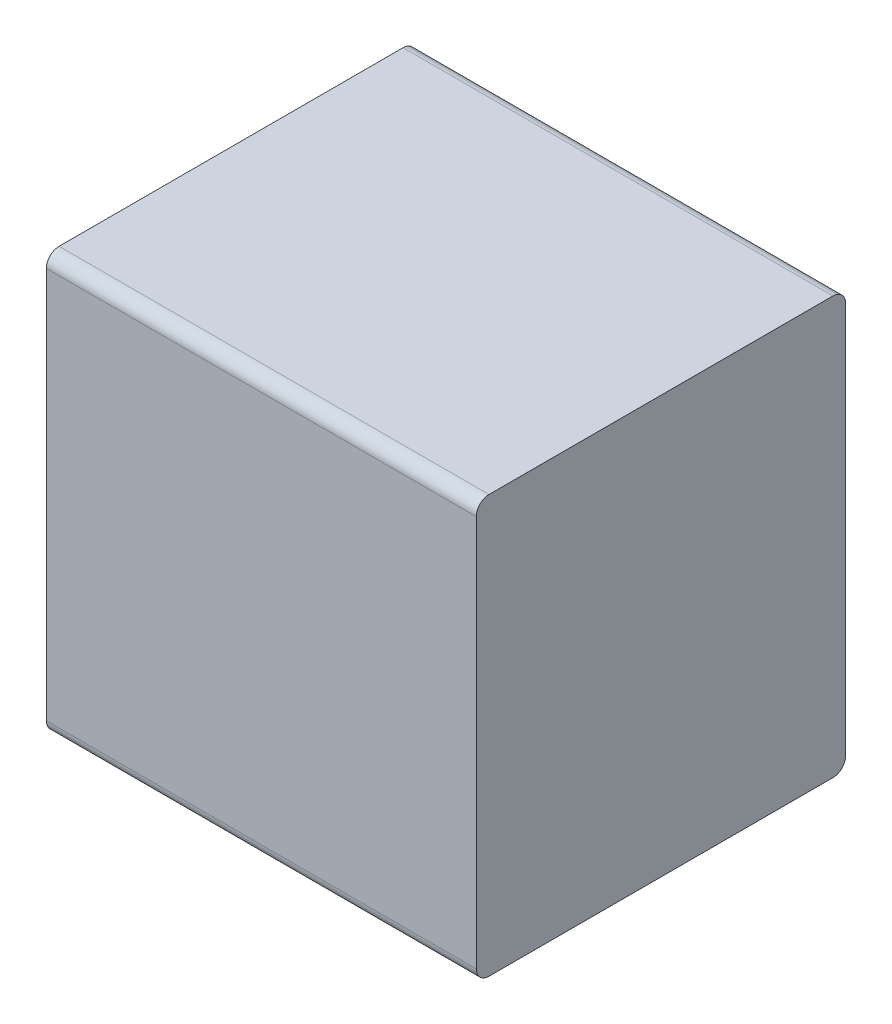
ISO-10303-21;
HEADER;
FILE_DESCRIPTION(('STEP AP214'),'2;1');
FILE_NAME('part.step','',(''),(''),'','','');
FILE_SCHEMA(('AUTOMOTIVE_DESIGN { 1 0 10303 214 1 1 1 1 }'));
ENDSEC;
DATA;
#1=APPLICATION_CONTEXT('core data for automotive mechanical design processes');
#2=APPLICATION_PROTOCOL_DEFINITION('international standard','automotive_design',2000,#1);
#3=PRODUCT_CONTEXT('',#1,'mechanical');
#4=PRODUCT('Part','Part','',(#3));
#5=PRODUCT_RELATED_PRODUCT_CATEGORY('part','',(#4));
#6=PRODUCT_DEFINITION_FORMATION('','',#4);
#7=PRODUCT_DEFINITION_CONTEXT('part definition',#1,'design');
#8=PRODUCT_DEFINITION('design','',#6,#7);
#9=PRODUCT_DEFINITION_SHAPE('','',#8);
#10=(LENGTH_UNIT() NAMED_UNIT(*) SI_UNIT(.MILLI.,.METRE.));
#11=(NAMED_UNIT(*) PLANE_ANGLE_UNIT() SI_UNIT($,.RADIAN.));
#12=(NAMED_UNIT(*) SI_UNIT($,.STERADIAN.) SOLID_ANGLE_UNIT());
#13=UNCERTAINTY_MEASURE_WITH_UNIT(LENGTH_MEASURE(1.E-05),#10,'distance_accuracy_value','');
#14=(GEOMETRIC_REPRESENTATION_CONTEXT(3) GLOBAL_UNCERTAINTY_ASSIGNED_CONTEXT((#13)) GLOBAL_UNIT_ASSIGNED_CONTEXT((#10,
#11,#12)) REPRESENTATION_CONTEXT('',''));
#15=CARTESIAN_POINT('',(0.,0.,0.));
#16=DIRECTION('',(0.,0.,1.));
#17=DIRECTION('',(1.,0.,0.));
#18=AXIS2_PLACEMENT_3D('',#15,#16,#17);
#19=CARTESIAN_POINT('',(500000.,0.886666666667,-0.360000000043));
#20=DIRECTION('',(0.,-1.,0.));
#21=DIRECTION('',(0.,0.,-1.));
#22=AXIS2_PLACEMENT_3D('',#19,#20,#21);
#23=PLANE('',#22);
#24=DIRECTION('',(-1.,0.,0.));
#25=VECTOR('',#24,1.);
#26=CARTESIAN_POINT('',(500000.,0.88666666666667,-0.360000000043368));
#27=LINE('',#26,#25);
#28=CARTESIAN_POINT('',(-0.450000000000546,0.886666666666918,-0.359999999999816));
#29=VERTEX_POINT('',#28);
#30=CARTESIAN_POINT('',(0.450000000000546,0.886666666666918,-0.359999999999816));
#31=VERTEX_POINT('',#30);
#32=EDGE_CURVE('E105',#29,#31,#27,.F.);
#33=ORIENTED_EDGE('',*,*,#32,.F.);
#34=DIRECTION('',(0.,0.,-1.));
#35=VECTOR('',#34,1.);
#36=CARTESIAN_POINT('',(-0.45,0.886666666667,-0.36));
#37=LINE('',#36,#35);
#38=CARTESIAN_POINT('',(-0.450000000000546,0.886666666666918,0.360000000000184));
#39=VERTEX_POINT('',#38);
#40=EDGE_CURVE('E104',#29,#39,#37,.F.);
#41=ORIENTED_EDGE('',*,*,#40,.T.);
#42=DIRECTION('',(-1.,0.,0.));
#43=VECTOR('',#42,1.);
#44=CARTESIAN_POINT('',(500000.,0.88666666666667,0.359999999956632));
#45=LINE('',#44,#43);
#46=CARTESIAN_POINT('',(0.450000000000546,0.886666666666918,0.360000000000184));
#47=VERTEX_POINT('',#46);
#48=EDGE_CURVE('E79',#47,#39,#45,.T.);
#49=ORIENTED_EDGE('',*,*,#48,.F.);
#50=DIRECTION('',(0.,0.,-1.));
#51=VECTOR('',#50,1.);
#52=CARTESIAN_POINT('',(0.45,0.886666666667,-0.4));
#53=LINE('',#52,#51);
#54=EDGE_CURVE('E128',#31,#47,#53,.F.);
#55=ORIENTED_EDGE('',*,*,#54,.F.);
#56=EDGE_LOOP('',(#33,#41,#49,#55));
#57=FACE_BOUND('',#56,.T.);
#58=ADVANCED_FACE('F17',(#57),#23,.F.);
#59=CARTESIAN_POINT('',(500000.,0.86,0.359999999957));
#60=DIRECTION('',(-1.,0.,0.));
#61=DIRECTION('',(0.,0.,1.));
#62=AXIS2_PLACEMENT_3D('',#59,#60,#61);
#63=CYLINDRICAL_SURFACE('',#62,0.02666666666667);
#64=CARTESIAN_POINT('',(-0.450000000000728,0.86,0.360000000000368));
#65=DIRECTION('',(-1.,0.,0.));
#66=DIRECTION('',(0.,0.,1.));
#67=AXIS2_PLACEMENT_3D('',#64,#65,#66);
#68=CIRCLE('',#67,0.02666666666667);
#69=CARTESIAN_POINT('',(-0.450000000000728,0.86,0.386666666666684));
#70=VERTEX_POINT('',#69);
#71=EDGE_CURVE('E20',#39,#70,#68,.F.);
#72=ORIENTED_EDGE('',*,*,#71,.T.);
#73=DIRECTION('',(-1.,0.,0.));
#74=VECTOR('',#73,1.);
#75=CARTESIAN_POINT('',(500000.,0.86,0.386666666623));
#76=LINE('',#75,#74);
#77=CARTESIAN_POINT('',(0.450000000000728,0.86,0.386666666666684));
#78=VERTEX_POINT('',#77);
#79=EDGE_CURVE('E86',#70,#78,#76,.F.);
#80=ORIENTED_EDGE('',*,*,#79,.T.);
#81=CARTESIAN_POINT('',(0.450000000000728,0.86,0.360000000000368));
#82=DIRECTION('',(-1.,0.,0.));
#83=DIRECTION('',(0.,0.,1.));
#84=AXIS2_PLACEMENT_3D('',#81,#82,#83);
#85=CIRCLE('',#84,0.02666666666667);
#86=EDGE_CURVE('E126',#47,#78,#85,.F.);
#87=ORIENTED_EDGE('',*,*,#86,.F.);
#88=ORIENTED_EDGE('',*,*,#48,.T.);
#89=EDGE_LOOP('',(#72,#80,#87,#88));
#90=FACE_BOUND('',#89,.T.);
#91=ADVANCED_FACE('F103',(#90),#63,.T.);
#92=CARTESIAN_POINT('',(500000.,0.86,0.386666666623));
#93=DIRECTION('',(0.,0.,-1.));
#94=DIRECTION('',(-1.,0.,0.));
#95=AXIS2_PLACEMENT_3D('',#92,#93,#94);
#96=PLANE('',#95);
#97=ORIENTED_EDGE('',*,*,#79,.F.);
#98=DIRECTION('',(0.,1.,0.));
#99=VECTOR('',#98,1.);
#100=CARTESIAN_POINT('',(-0.45,0.86,0.386666666667));
#101=LINE('',#100,#99);
#102=CARTESIAN_POINT('',(-0.450000000000546,0.04,0.38666666666701));
#103=VERTEX_POINT('',#102);
#104=EDGE_CURVE('E90',#70,#103,#101,.F.);
#105=ORIENTED_EDGE('',*,*,#104,.T.);
#106=DIRECTION('',(-1.,0.,0.));
#107=VECTOR('',#106,1.);
#108=CARTESIAN_POINT('',(500000.,0.04,0.38666666662367));
#109=LINE('',#108,#107);
#110=CARTESIAN_POINT('',(0.450000000000546,0.04,0.386666666667009));
#111=VERTEX_POINT('',#110);
#112=EDGE_CURVE('E92',#111,#103,#109,.T.);
#113=ORIENTED_EDGE('',*,*,#112,.F.);
#114=DIRECTION('',(0.,1.,0.));
#115=VECTOR('',#114,1.);
#116=CARTESIAN_POINT('',(0.45,0.9,0.386666666667));
#117=LINE('',#116,#115);
#118=EDGE_CURVE('E91',#78,#111,#117,.F.);
#119=ORIENTED_EDGE('',*,*,#118,.F.);
#120=EDGE_LOOP('',(#97,#105,#113,#119));
#121=FACE_BOUND('',#120,.T.);
#122=ADVANCED_FACE('F88',(#121),#96,.F.);
#123=CARTESIAN_POINT('',(500000.,0.04,0.359999999957));
#124=DIRECTION('',(-1.,0.,0.));
#125=DIRECTION('',(0.,0.,1.));
#126=AXIS2_PLACEMENT_3D('',#123,#124,#125);
#127=CYLINDRICAL_SURFACE('',#126,0.02666666666667);
#128=CARTESIAN_POINT('',(-0.450000000000728,0.04,0.360000000000368));
#129=DIRECTION('',(-1.,0.,0.));
#130=DIRECTION('',(0.,0.,1.));
#131=AXIS2_PLACEMENT_3D('',#128,#129,#130);
#132=CIRCLE('',#131,0.02666666666667);
#133=CARTESIAN_POINT('',(-0.450000000000546,0.01333333333333,0.360000000000184));
#134=VERTEX_POINT('',#133);
#135=EDGE_CURVE('E101',#103,#134,#132,.F.);
#136=ORIENTED_EDGE('',*,*,#135,.T.);
#137=DIRECTION('',(1.,0.,0.));
#138=VECTOR('',#137,1.);
#139=CARTESIAN_POINT('',(500000.,0.01333333333333,0.36));
#140=LINE('',#139,#138);
#141=CARTESIAN_POINT('',(0.450000000000546,0.01333333333333,0.360000000000184));
#142=VERTEX_POINT('',#141);
#143=EDGE_CURVE('E109',#134,#142,#140,.T.);
#144=ORIENTED_EDGE('',*,*,#143,.T.);
#145=CARTESIAN_POINT('',(0.450000000000728,0.04,0.360000000000368));
#146=DIRECTION('',(-1.,0.,0.));
#147=DIRECTION('',(0.,0.,1.));
#148=AXIS2_PLACEMENT_3D('',#145,#146,#147);
#149=CIRCLE('',#148,0.02666666666667);
#150=EDGE_CURVE('E124',#111,#142,#149,.F.);
#151=ORIENTED_EDGE('',*,*,#150,.F.);
#152=ORIENTED_EDGE('',*,*,#112,.T.);
#153=EDGE_LOOP('',(#136,#144,#151,#152));
#154=FACE_BOUND('',#153,.T.);
#155=ADVANCED_FACE('F163',(#154),#127,.T.);
#156=CARTESIAN_POINT('',(500000.,0.01333333333333,0.359999999957));
#157=DIRECTION('',(0.,1.,0.));
#158=DIRECTION('',(0.,0.,1.));
#159=AXIS2_PLACEMENT_3D('',#156,#157,#158);
#160=PLANE('',#159);
#161=ORIENTED_EDGE('',*,*,#143,.F.);
#162=DIRECTION('',(0.,0.,-1.));
#163=VECTOR('',#162,1.);
#164=CARTESIAN_POINT('',(-0.45,0.01333333333333,-0.36));
#165=LINE('',#164,#163);
#166=CARTESIAN_POINT('',(-0.450000000000546,0.01333333333333,-0.359999999999816));
#167=VERTEX_POINT('',#166);
#168=EDGE_CURVE('E134',#134,#167,#165,.T.);
#169=ORIENTED_EDGE('',*,*,#168,.T.);
#170=DIRECTION('',(-1.,0.,0.));
#171=VECTOR('',#170,1.);
#172=CARTESIAN_POINT('',(500000.,0.01333333333333,-0.360000000043368));
#173=LINE('',#172,#171);
#174=CARTESIAN_POINT('',(0.450000000000546,0.01333333333333,-0.359999999999816));
#175=VERTEX_POINT('',#174);
#176=EDGE_CURVE('E113',#175,#167,#173,.T.);
#177=ORIENTED_EDGE('',*,*,#176,.F.);
#178=DIRECTION('',(0.,0.,-1.));
#179=VECTOR('',#178,1.);
#180=CARTESIAN_POINT('',(0.45,0.01333333333333,-0.4));
#181=LINE('',#180,#179);
#182=EDGE_CURVE('E123',#142,#175,#181,.T.);
#183=ORIENTED_EDGE('',*,*,#182,.F.);
#184=EDGE_LOOP('',(#161,#169,#177,#183));
#185=FACE_BOUND('',#184,.T.);
#186=ADVANCED_FACE('F152',(#185),#160,.F.);
#187=CARTESIAN_POINT('',(500000.,0.86,-0.360000000043));
#188=DIRECTION('',(-1.,0.,0.));
#189=DIRECTION('',(0.,0.,1.));
#190=AXIS2_PLACEMENT_3D('',#187,#188,#189);
#191=CYLINDRICAL_SURFACE('',#190,0.02666666666667);
#192=CARTESIAN_POINT('',(-0.450000000000728,0.86,-0.359999999999632));
#193=DIRECTION('',(-1.,0.,0.));
#194=DIRECTION('',(0.,0.,1.));
#195=AXIS2_PLACEMENT_3D('',#192,#193,#194);
#196=CIRCLE('',#195,0.02666666666667);
#197=CARTESIAN_POINT('',(-0.450000000000728,0.86,-0.386666666666632));
#198=VERTEX_POINT('',#197);
#199=EDGE_CURVE('E116',#198,#29,#196,.F.);
#200=ORIENTED_EDGE('',*,*,#199,.T.);
#201=ORIENTED_EDGE('',*,*,#32,.T.);
#202=CARTESIAN_POINT('',(0.450000000000728,0.86,-0.359999999999632));
#203=DIRECTION('',(-1.,0.,0.));
#204=DIRECTION('',(0.,0.,1.));
#205=AXIS2_PLACEMENT_3D('',#202,#203,#204);
#206=CIRCLE('',#205,0.02666666666667);
#207=CARTESIAN_POINT('',(0.450000000000728,0.86,-0.386666666666632));
#208=VERTEX_POINT('',#207);
#209=EDGE_CURVE('E129',#208,#31,#206,.F.);
#210=ORIENTED_EDGE('',*,*,#209,.F.);
#211=DIRECTION('',(1.,0.,0.));
#212=VECTOR('',#211,1.);
#213=CARTESIAN_POINT('',(500000.,0.86,-0.38666666671));
#214=LINE('',#213,#212);
#215=EDGE_CURVE('E122',#208,#198,#214,.F.);
#216=ORIENTED_EDGE('',*,*,#215,.T.);
#217=EDGE_LOOP('',(#200,#201,#210,#216));
#218=FACE_BOUND('',#217,.T.);
#219=ADVANCED_FACE('F160',(#218),#191,.T.);
#220=CARTESIAN_POINT('',(-0.45,0.86,-0.36));
#221=DIRECTION('',(1.,0.,0.));
#222=DIRECTION('',(0.,0.,-1.));
#223=AXIS2_PLACEMENT_3D('',#220,#221,#222);
#224=PLANE('',#223);
#225=DIRECTION('',(0.,1.,0.));
#226=VECTOR('',#225,1.);
#227=CARTESIAN_POINT('',(-0.450000000000728,0.04,-0.386666666666632));
#228=LINE('',#227,#226);
#229=CARTESIAN_POINT('',(-0.450000000000728,0.04,-0.386666666666632));
#230=VERTEX_POINT('',#229);
#231=EDGE_CURVE('E141',#198,#230,#228,.F.);
#232=ORIENTED_EDGE('',*,*,#231,.T.);
#233=CARTESIAN_POINT('',(-0.450000000000728,0.04,-0.359999999999632));
#234=DIRECTION('',(-1.,0.,0.));
#235=DIRECTION('',(0.,0.,1.));
#236=AXIS2_PLACEMENT_3D('',#233,#234,#235);
#237=CIRCLE('',#236,0.02666666666667);
#238=EDGE_CURVE('E115',#167,#230,#237,.F.);
#239=ORIENTED_EDGE('',*,*,#238,.F.);
#240=ORIENTED_EDGE('',*,*,#168,.F.);
#241=ORIENTED_EDGE('',*,*,#135,.F.);
#242=ORIENTED_EDGE('',*,*,#104,.F.);
#243=ORIENTED_EDGE('',*,*,#71,.F.);
#244=ORIENTED_EDGE('',*,*,#40,.F.);
#245=ORIENTED_EDGE('',*,*,#199,.F.);
#246=EDGE_LOOP('',(#232,#239,#240,#241,#242,#243,#244,#245));
#247=FACE_BOUND('',#246,.T.);
#248=ADVANCED_FACE('F97',(#247),#224,.F.);
#249=CARTESIAN_POINT('',(500000.,0.04,-0.360000000043));
#250=DIRECTION('',(-1.,0.,0.));
#251=DIRECTION('',(0.,0.,1.));
#252=AXIS2_PLACEMENT_3D('',#249,#250,#251);
#253=CYLINDRICAL_SURFACE('',#252,0.02666666666667);
#254=ORIENTED_EDGE('',*,*,#238,.T.);
#255=DIRECTION('',(1.,0.,0.));
#256=VECTOR('',#255,1.);
#257=CARTESIAN_POINT('',(500000.,0.04,-0.38666666671));
#258=LINE('',#257,#256);
#259=CARTESIAN_POINT('',(0.450000000000728,0.04,-0.386666666666632));
#260=VERTEX_POINT('',#259);
#261=EDGE_CURVE('E26',#230,#260,#258,.T.);
#262=ORIENTED_EDGE('',*,*,#261,.T.);
#263=CARTESIAN_POINT('',(0.450000000000728,0.04,-0.359999999999632));
#264=DIRECTION('',(-1.,0.,0.));
#265=DIRECTION('',(0.,0.,1.));
#266=AXIS2_PLACEMENT_3D('',#263,#264,#265);
#267=CIRCLE('',#266,0.02666666666667);
#268=EDGE_CURVE('E34',#175,#260,#267,.F.);
#269=ORIENTED_EDGE('',*,*,#268,.F.);
#270=ORIENTED_EDGE('',*,*,#176,.T.);
#271=EDGE_LOOP('',(#254,#262,#269,#270));
#272=FACE_BOUND('',#271,.T.);
#273=ADVANCED_FACE('F154',(#272),#253,.T.);
#274=CARTESIAN_POINT('',(0.45,0.9,-0.4));
#275=DIRECTION('',(1.,0.,0.));
#276=DIRECTION('',(0.,0.,-1.));
#277=AXIS2_PLACEMENT_3D('',#274,#275,#276);
#278=PLANE('',#277);
#279=ORIENTED_EDGE('',*,*,#268,.T.);
#280=DIRECTION('',(0.,1.,0.));
#281=VECTOR('',#280,1.);
#282=CARTESIAN_POINT('',(0.450000000000728,0.04,-0.386666666666632));
#283=LINE('',#282,#281);
#284=EDGE_CURVE('E11',#260,#208,#283,.T.);
#285=ORIENTED_EDGE('',*,*,#284,.T.);
#286=ORIENTED_EDGE('',*,*,#209,.T.);
#287=ORIENTED_EDGE('',*,*,#54,.T.);
#288=ORIENTED_EDGE('',*,*,#86,.T.);
#289=ORIENTED_EDGE('',*,*,#118,.T.);
#290=ORIENTED_EDGE('',*,*,#150,.T.);
#291=ORIENTED_EDGE('',*,*,#182,.T.);
#292=EDGE_LOOP('',(#279,#285,#286,#287,#288,#289,#290,#291));
#293=FACE_BOUND('',#292,.T.);
#294=ADVANCED_FACE('F150',(#293),#278,.T.);
#295=CARTESIAN_POINT('',(500000.,0.04,-0.38666666671));
#296=DIRECTION('',(0.,0.,1.));
#297=DIRECTION('',(1.,0.,0.));
#298=AXIS2_PLACEMENT_3D('',#295,#296,#297);
#299=PLANE('',#298);
#300=ORIENTED_EDGE('',*,*,#261,.F.);
#301=ORIENTED_EDGE('',*,*,#231,.F.);
#302=ORIENTED_EDGE('',*,*,#215,.F.);
#303=ORIENTED_EDGE('',*,*,#284,.F.);
#304=EDGE_LOOP('',(#300,#301,#302,#303));
#305=FACE_BOUND('',#304,.T.);
#306=ADVANCED_FACE('F158',(#305),#299,.F.);
#307=CLOSED_SHELL('',(#58,#91,#122,#155,#186,#219,#248,#273,#294,#306));
#308=MANIFOLD_SOLID_BREP('B1',#307);
#309=ADVANCED_BREP_SHAPE_REPRESENTATION('',(#18,#308),#14);
#310=SHAPE_DEFINITION_REPRESENTATION(#9,#309);
ENDSEC;
END-ISO-10303-21;
